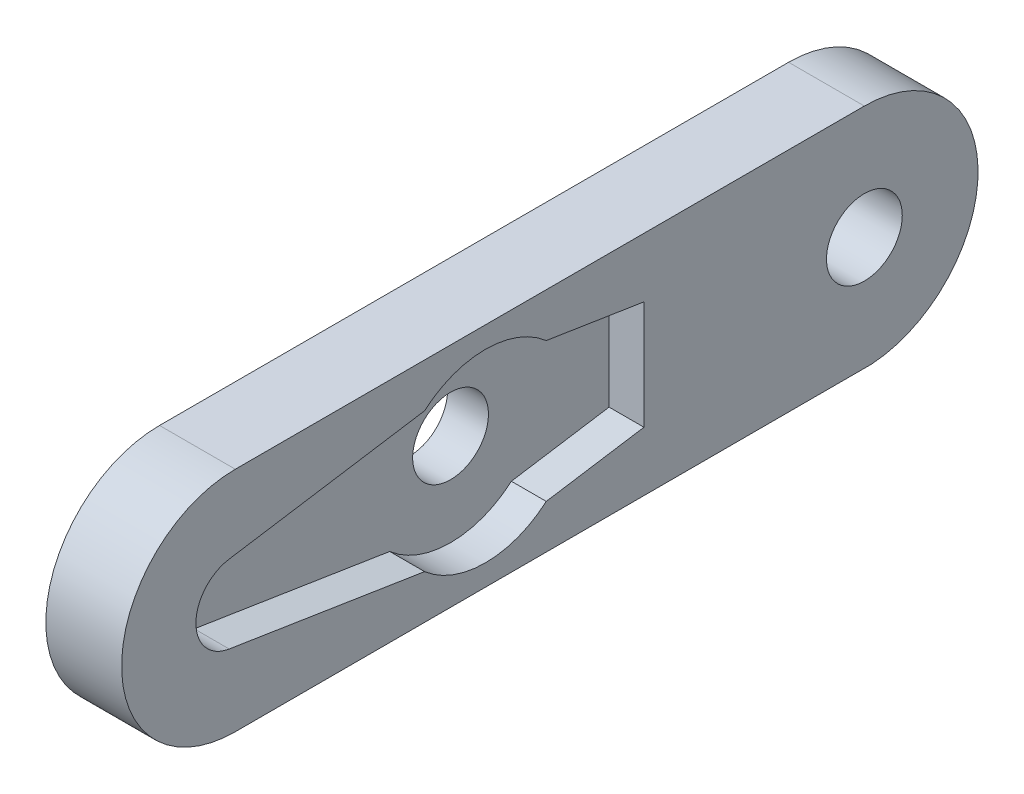
ISO-10303-21;
HEADER;
FILE_DESCRIPTION(('STEP AP214'),'2;1');
FILE_NAME('part.step','',(''),(''),'','','');
FILE_SCHEMA(('AUTOMOTIVE_DESIGN { 1 0 10303 214 1 1 1 1 }'));
ENDSEC;
DATA;
#1=APPLICATION_CONTEXT('core data for automotive mechanical design processes');
#2=APPLICATION_PROTOCOL_DEFINITION('international standard','automotive_design',2000,#1);
#3=PRODUCT_CONTEXT('',#1,'mechanical');
#4=PRODUCT('Part','Part','',(#3));
#5=PRODUCT_RELATED_PRODUCT_CATEGORY('part','',(#4));
#6=PRODUCT_DEFINITION_FORMATION('','',#4);
#7=PRODUCT_DEFINITION_CONTEXT('part definition',#1,'design');
#8=PRODUCT_DEFINITION('design','',#6,#7);
#9=PRODUCT_DEFINITION_SHAPE('','',#8);
#10=(LENGTH_UNIT() NAMED_UNIT(*) SI_UNIT(.MILLI.,.METRE.));
#11=(NAMED_UNIT(*) PLANE_ANGLE_UNIT() SI_UNIT($,.RADIAN.));
#12=(NAMED_UNIT(*) SI_UNIT($,.STERADIAN.) SOLID_ANGLE_UNIT());
#13=UNCERTAINTY_MEASURE_WITH_UNIT(LENGTH_MEASURE(1.E-05),#10,'distance_accuracy_value','');
#14=(GEOMETRIC_REPRESENTATION_CONTEXT(3) GLOBAL_UNCERTAINTY_ASSIGNED_CONTEXT((#13)) GLOBAL_UNIT_ASSIGNED_CONTEXT((#10,
#11,#12)) REPRESENTATION_CONTEXT('',''));
#15=CARTESIAN_POINT('',(0.,0.,0.));
#16=DIRECTION('',(0.,0.,1.));
#17=DIRECTION('',(1.,0.,0.));
#18=AXIS2_PLACEMENT_3D('',#15,#16,#17);
#19=CARTESIAN_POINT('',(2.3,0.,0.));
#20=DIRECTION('',(-1.,0.,0.));
#21=DIRECTION('',(0.,0.,1.));
#22=AXIS2_PLACEMENT_3D('',#19,#20,#21);
#23=CYLINDRICAL_SURFACE('',#22,6.1);
#24=CARTESIAN_POINT('',(0.,0.,0.));
#25=DIRECTION('',(1.,0.,0.));
#26=DIRECTION('',(0.,0.,-1.));
#27=AXIS2_PLACEMENT_3D('',#24,#25,#26);
#28=CIRCLE('',#27,6.1);
#29=CARTESIAN_POINT('',(0.,-4.59428599586623,4.0127965545474));
#30=VERTEX_POINT('',#29);
#31=CARTESIAN_POINT('',(0.,-4.59428599586623,-4.0127965545474));
#32=VERTEX_POINT('',#31);
#33=EDGE_CURVE('E177',#30,#32,#28,.T.);
#34=ORIENTED_EDGE('',*,*,#33,.F.);
#35=DIRECTION('',(-1.,0.,0.));
#36=VECTOR('',#35,1.);
#37=CARTESIAN_POINT('',(2.3,-4.59428599586623,4.0127965545474));
#38=LINE('',#37,#36);
#39=CARTESIAN_POINT('',(2.3,-4.59428599586623,4.0127965545474));
#40=VERTEX_POINT('',#39);
#41=EDGE_CURVE('E12',#40,#30,#38,.T.);
#42=ORIENTED_EDGE('',*,*,#41,.F.);
#43=CARTESIAN_POINT('',(2.3,0.,0.));
#44=DIRECTION('',(1.,0.,0.));
#45=DIRECTION('',(0.,0.,-1.));
#46=AXIS2_PLACEMENT_3D('',#43,#44,#45);
#47=CIRCLE('',#46,6.1);
#48=CARTESIAN_POINT('',(2.3,-4.59428599586623,-4.0127965545474));
#49=VERTEX_POINT('',#48);
#50=EDGE_CURVE('E271',#40,#49,#47,.T.);
#51=ORIENTED_EDGE('',*,*,#50,.T.);
#52=DIRECTION('',(-1.,0.,0.));
#53=VECTOR('',#52,1.);
#54=CARTESIAN_POINT('',(2.3,-4.59428599586623,-4.0127965545474));
#55=LINE('',#54,#53);
#56=EDGE_CURVE('E80',#49,#32,#55,.T.);
#57=ORIENTED_EDGE('',*,*,#56,.T.);
#58=EDGE_LOOP('',(#34,#42,#51,#57));
#59=FACE_BOUND('',#58,.T.);
#60=ADVANCED_FACE('F60',(#59),#23,.F.);
#61=CARTESIAN_POINT('',(2.3,-5.09897447345055,0.801308910131236));
#62=DIRECTION('',(0.,0.987875892570632,-0.155245679095352));
#63=DIRECTION('',(0.,0.155245679095352,0.987875892570632));
#64=AXIS2_PLACEMENT_3D('',#61,#62,#63);
#65=PLANE('',#64);
#66=DIRECTION('',(0.,-0.155245679095352,-0.987875892570632));
#67=VECTOR('',#66,1.);
#68=CARTESIAN_POINT('',(0.,-5.09897447345055,0.801308910131236));
#69=LINE('',#68,#67);
#70=CARTESIAN_POINT('',(0.,-2.56847732068365,16.9036387656479));
#71=VERTEX_POINT('',#70);
#72=EDGE_CURVE('E181',#71,#30,#69,.T.);
#73=ORIENTED_EDGE('',*,*,#72,.F.);
#74=DIRECTION('',(-1.,0.,0.));
#75=VECTOR('',#74,1.);
#76=CARTESIAN_POINT('',(2.3,-2.56847732068365,16.9036387656479));
#77=LINE('',#76,#75);
#78=CARTESIAN_POINT('',(2.3,-2.56847732068365,16.9036387656479));
#79=VERTEX_POINT('',#78);
#80=EDGE_CURVE('E71',#79,#71,#77,.T.);
#81=ORIENTED_EDGE('',*,*,#80,.F.);
#82=DIRECTION('',(0.,-0.155245679095352,-0.987875892570632));
#83=VECTOR('',#82,1.);
#84=CARTESIAN_POINT('',(2.3,-5.09897447345055,0.801308910131236));
#85=LINE('',#84,#83);
#86=EDGE_CURVE('E274',#79,#40,#85,.T.);
#87=ORIENTED_EDGE('',*,*,#86,.T.);
#88=ORIENTED_EDGE('',*,*,#41,.T.);
#89=EDGE_LOOP('',(#73,#81,#87,#88));
#90=FACE_BOUND('',#89,.T.);
#91=ADVANCED_FACE('F307',(#90),#65,.T.);
#92=CARTESIAN_POINT('',(2.3,0.,16.5));
#93=DIRECTION('',(-1.,0.,0.));
#94=DIRECTION('',(0.,0.,1.));
#95=AXIS2_PLACEMENT_3D('',#92,#93,#94);
#96=CYLINDRICAL_SURFACE('',#95,2.6);
#97=CARTESIAN_POINT('',(0.,0.,16.5));
#98=DIRECTION('',(1.,0.,0.));
#99=DIRECTION('',(0.,0.,-1.));
#100=AXIS2_PLACEMENT_3D('',#97,#98,#99);
#101=CIRCLE('',#100,2.6);
#102=CARTESIAN_POINT('',(0.,2.56847732068364,16.9036387656479));
#103=VERTEX_POINT('',#102);
#104=EDGE_CURVE('E186',#103,#71,#101,.T.);
#105=ORIENTED_EDGE('',*,*,#104,.F.);
#106=DIRECTION('',(-1.,0.,0.));
#107=VECTOR('',#106,1.);
#108=CARTESIAN_POINT('',(2.3,2.56847732068364,16.9036387656479));
#109=LINE('',#108,#107);
#110=CARTESIAN_POINT('',(2.3,2.56847732068364,16.9036387656479));
#111=VERTEX_POINT('',#110);
#112=EDGE_CURVE('E218',#111,#103,#109,.T.);
#113=ORIENTED_EDGE('',*,*,#112,.F.);
#114=CARTESIAN_POINT('',(2.3,0.,16.5));
#115=DIRECTION('',(1.,0.,0.));
#116=DIRECTION('',(0.,0.,-1.));
#117=AXIS2_PLACEMENT_3D('',#114,#115,#116);
#118=CIRCLE('',#117,2.6);
#119=EDGE_CURVE('E278',#111,#79,#118,.T.);
#120=ORIENTED_EDGE('',*,*,#119,.T.);
#121=ORIENTED_EDGE('',*,*,#80,.T.);
#122=EDGE_LOOP('',(#105,#113,#120,#121));
#123=FACE_BOUND('',#122,.T.);
#124=ADVANCED_FACE('F312',(#123),#96,.F.);
#125=CARTESIAN_POINT('',(2.3,5.09897447345054,0.801308910131234));
#126=DIRECTION('',(0.,-0.987875892570632,-0.155245679095352));
#127=DIRECTION('',(0.,0.155245679095352,-0.987875892570632));
#128=AXIS2_PLACEMENT_3D('',#125,#126,#127);
#129=PLANE('',#128);
#130=DIRECTION('',(0.,-0.155245679095352,0.987875892570632));
#131=VECTOR('',#130,1.);
#132=CARTESIAN_POINT('',(0.,5.09897447345054,0.801308910131234));
#133=LINE('',#132,#131);
#134=CARTESIAN_POINT('',(0.,4.59428599586623,4.0127965545474));
#135=VERTEX_POINT('',#134);
#136=EDGE_CURVE('E190',#135,#103,#133,.T.);
#137=ORIENTED_EDGE('',*,*,#136,.F.);
#138=DIRECTION('',(-1.,0.,0.));
#139=VECTOR('',#138,1.);
#140=CARTESIAN_POINT('',(2.3,4.59428599586623,4.0127965545474));
#141=LINE('',#140,#139);
#142=CARTESIAN_POINT('',(2.3,4.59428599586623,4.0127965545474));
#143=VERTEX_POINT('',#142);
#144=EDGE_CURVE('E215',#143,#135,#141,.T.);
#145=ORIENTED_EDGE('',*,*,#144,.F.);
#146=DIRECTION('',(0.,-0.155245679095352,0.987875892570632));
#147=VECTOR('',#146,1.);
#148=CARTESIAN_POINT('',(2.3,5.09897447345054,0.801308910131234));
#149=LINE('',#148,#147);
#150=EDGE_CURVE('E170',#143,#111,#149,.T.);
#151=ORIENTED_EDGE('',*,*,#150,.T.);
#152=ORIENTED_EDGE('',*,*,#112,.T.);
#153=EDGE_LOOP('',(#137,#145,#151,#152));
#154=FACE_BOUND('',#153,.T.);
#155=ADVANCED_FACE('F285',(#154),#129,.T.);
#156=CARTESIAN_POINT('',(2.3,0.,0.));
#157=DIRECTION('',(-1.,0.,0.));
#158=DIRECTION('',(0.,0.,1.));
#159=AXIS2_PLACEMENT_3D('',#156,#157,#158);
#160=CYLINDRICAL_SURFACE('',#159,6.10000000000002);
#161=CARTESIAN_POINT('',(0.,0.,0.));
#162=DIRECTION('',(1.,0.,0.));
#163=DIRECTION('',(0.,0.,-1.));
#164=AXIS2_PLACEMENT_3D('',#161,#162,#163);
#165=CIRCLE('',#164,6.10000000000002);
#166=CARTESIAN_POINT('',(0.,4.59428599586622,-4.0127965545474));
#167=VERTEX_POINT('',#166);
#168=EDGE_CURVE('E194',#167,#135,#165,.T.);
#169=ORIENTED_EDGE('',*,*,#168,.F.);
#170=DIRECTION('',(-1.,0.,0.));
#171=VECTOR('',#170,1.);
#172=CARTESIAN_POINT('',(2.3,4.59428599586622,-4.0127965545474));
#173=LINE('',#172,#171);
#174=CARTESIAN_POINT('',(2.3,4.59428599586622,-4.0127965545474));
#175=VERTEX_POINT('',#174);
#176=EDGE_CURVE('E152',#175,#167,#173,.T.);
#177=ORIENTED_EDGE('',*,*,#176,.F.);
#178=CARTESIAN_POINT('',(2.3,0.,0.));
#179=DIRECTION('',(1.,0.,0.));
#180=DIRECTION('',(0.,0.,-1.));
#181=AXIS2_PLACEMENT_3D('',#178,#179,#180);
#182=CIRCLE('',#181,6.10000000000002);
#183=EDGE_CURVE('E166',#175,#143,#182,.T.);
#184=ORIENTED_EDGE('',*,*,#183,.T.);
#185=ORIENTED_EDGE('',*,*,#144,.T.);
#186=EDGE_LOOP('',(#169,#177,#184,#185));
#187=FACE_BOUND('',#186,.T.);
#188=ADVANCED_FACE('F291',(#187),#160,.F.);
#189=CARTESIAN_POINT('',(2.3,5.09897447345054,-0.801308910131233));
#190=DIRECTION('',(0.,-0.987875892570632,0.155245679095352));
#191=DIRECTION('',(0.,-0.155245679095352,-0.987875892570632));
#192=AXIS2_PLACEMENT_3D('',#189,#190,#191);
#193=PLANE('',#192);
#194=DIRECTION('',(0.,0.155245679095352,0.987875892570632));
#195=VECTOR('',#194,1.);
#196=CARTESIAN_POINT('',(0.,5.09897447345054,-0.801308910131233));
#197=LINE('',#196,#195);
#198=CARTESIAN_POINT('',(0.,3.58138165827493,-10.4582176600977));
#199=VERTEX_POINT('',#198);
#200=EDGE_CURVE('E148',#199,#167,#197,.T.);
#201=ORIENTED_EDGE('',*,*,#200,.F.);
#202=DIRECTION('',(-1.,0.,0.));
#203=VECTOR('',#202,1.);
#204=CARTESIAN_POINT('',(2.3,3.58138165827493,-10.4582176600977));
#205=LINE('',#204,#203);
#206=CARTESIAN_POINT('',(2.3,3.58138165827493,-10.4582176600977));
#207=VERTEX_POINT('',#206);
#208=EDGE_CURVE('E142',#207,#199,#205,.T.);
#209=ORIENTED_EDGE('',*,*,#208,.F.);
#210=DIRECTION('',(0.,0.155245679095352,0.987875892570632));
#211=VECTOR('',#210,1.);
#212=CARTESIAN_POINT('',(2.3,5.09897447345054,-0.801308910131233));
#213=LINE('',#212,#211);
#214=EDGE_CURVE('E146',#207,#175,#213,.T.);
#215=ORIENTED_EDGE('',*,*,#214,.T.);
#216=ORIENTED_EDGE('',*,*,#176,.T.);
#217=EDGE_LOOP('',(#201,#209,#215,#216));
#218=FACE_BOUND('',#217,.T.);
#219=ADVANCED_FACE('F144',(#218),#193,.T.);
#220=CARTESIAN_POINT('',(2.3,0.,-10.4582176600977));
#221=DIRECTION('',(0.,0.,-1.));
#222=DIRECTION('',(0.,1.,0.));
#223=AXIS2_PLACEMENT_3D('',#220,#221,#222);
#224=PLANE('',#223);
#225=DIRECTION('',(0.,-1.,0.));
#226=VECTOR('',#225,1.);
#227=CARTESIAN_POINT('',(0.,0.,-10.4582176600977));
#228=LINE('',#227,#226);
#229=CARTESIAN_POINT('',(0.,-3.58138165827494,-10.4582176600977));
#230=VERTEX_POINT('',#229);
#231=EDGE_CURVE('E200',#199,#230,#228,.T.);
#232=ORIENTED_EDGE('',*,*,#231,.T.);
#233=DIRECTION('',(-1.,0.,0.));
#234=VECTOR('',#233,1.);
#235=CARTESIAN_POINT('',(2.3,-3.58138165827494,-10.4582176600977));
#236=LINE('',#235,#234);
#237=CARTESIAN_POINT('',(2.3,-3.58138165827494,-10.4582176600977));
#238=VERTEX_POINT('',#237);
#239=EDGE_CURVE('E105',#238,#230,#236,.T.);
#240=ORIENTED_EDGE('',*,*,#239,.F.);
#241=DIRECTION('',(0.,-1.,0.));
#242=VECTOR('',#241,1.);
#243=CARTESIAN_POINT('',(2.3,0.,-10.4582176600977));
#244=LINE('',#243,#242);
#245=EDGE_CURVE('E154',#207,#238,#244,.T.);
#246=ORIENTED_EDGE('',*,*,#245,.F.);
#247=ORIENTED_EDGE('',*,*,#208,.T.);
#248=EDGE_LOOP('',(#232,#240,#246,#247));
#249=FACE_BOUND('',#248,.T.);
#250=ADVANCED_FACE('F155',(#249),#224,.F.);
#251=CARTESIAN_POINT('',(2.3,0.,16.5));
#252=DIRECTION('',(-1.,0.,0.));
#253=DIRECTION('',(0.,0.,1.));
#254=AXIS2_PLACEMENT_3D('',#251,#252,#253);
#255=CYLINDRICAL_SURFACE('',#254,7.5);
#256=DIRECTION('',(-1.,0.,0.));
#257=VECTOR('',#256,1.);
#258=CARTESIAN_POINT('',(2.3,7.5,16.5));
#259=LINE('',#258,#257);
#260=CARTESIAN_POINT('',(2.3,7.5,16.5));
#261=VERTEX_POINT('',#260);
#262=CARTESIAN_POINT('',(-2.7,7.5,16.5));
#263=VERTEX_POINT('',#262);
#264=EDGE_CURVE('E176',#261,#263,#259,.T.);
#265=ORIENTED_EDGE('',*,*,#264,.T.);
#266=CARTESIAN_POINT('',(-2.7,0.,16.5));
#267=DIRECTION('',(-1.,0.,0.));
#268=DIRECTION('',(0.,0.,1.));
#269=AXIS2_PLACEMENT_3D('',#266,#267,#268);
#270=CIRCLE('',#269,7.5);
#271=CARTESIAN_POINT('',(-2.7,-7.5,16.5));
#272=VERTEX_POINT('',#271);
#273=EDGE_CURVE('E245',#272,#263,#270,.T.);
#274=ORIENTED_EDGE('',*,*,#273,.F.);
#275=DIRECTION('',(-1.,0.,0.));
#276=VECTOR('',#275,1.);
#277=CARTESIAN_POINT('',(2.3,-7.50000000000001,16.5));
#278=LINE('',#277,#276);
#279=CARTESIAN_POINT('',(2.3,-7.50000000000001,16.5));
#280=VERTEX_POINT('',#279);
#281=EDGE_CURVE('E210',#280,#272,#278,.T.);
#282=ORIENTED_EDGE('',*,*,#281,.F.);
#283=CARTESIAN_POINT('',(2.3,0.,16.5));
#284=DIRECTION('',(1.,0.,0.));
#285=DIRECTION('',(0.,0.,-1.));
#286=AXIS2_PLACEMENT_3D('',#283,#284,#285);
#287=CIRCLE('',#286,7.5);
#288=EDGE_CURVE('E207',#261,#280,#287,.T.);
#289=ORIENTED_EDGE('',*,*,#288,.F.);
#290=EDGE_LOOP('',(#265,#274,#282,#289));
#291=FACE_BOUND('',#290,.T.);
#292=ADVANCED_FACE('F62',(#291),#255,.T.);
#293=CARTESIAN_POINT('',(2.3,-7.49309549458025,-0.00313492670834083));
#294=DIRECTION('',(0.,0.99999991248103,0.000418375347844261));
#295=DIRECTION('',(0.,-0.000418375347844261,0.99999991248103));
#296=AXIS2_PLACEMENT_3D('',#293,#294,#295);
#297=PLANE('',#296);
#298=ORIENTED_EDGE('',*,*,#281,.T.);
#299=DIRECTION('',(0.,-0.00041837534784426,0.99999991248103));
#300=VECTOR('',#299,1.);
#301=CARTESIAN_POINT('',(-2.7,-7.48452785045643,-20.4815006290153));
#302=LINE('',#301,#300);
#303=CARTESIAN_POINT('',(-2.7,-7.48452785045643,-20.4815006290153));
#304=VERTEX_POINT('',#303);
#305=EDGE_CURVE('E182',#304,#272,#302,.T.);
#306=ORIENTED_EDGE('',*,*,#305,.F.);
#307=DIRECTION('',(-1.,0.,0.));
#308=VECTOR('',#307,1.);
#309=CARTESIAN_POINT('',(2.3,-7.48452785045643,-20.4815006290153));
#310=LINE('',#309,#308);
#311=CARTESIAN_POINT('',(2.3,-7.48452785045643,-20.4815006290153));
#312=VERTEX_POINT('',#311);
#313=EDGE_CURVE('E226',#312,#304,#310,.T.);
#314=ORIENTED_EDGE('',*,*,#313,.F.);
#315=DIRECTION('',(0.,0.000418375347844261,-0.99999991248103));
#316=VECTOR('',#315,1.);
#317=CARTESIAN_POINT('',(2.3,-7.49309549458025,-0.00313492670834083));
#318=LINE('',#317,#316);
#319=EDGE_CURVE('E117',#280,#312,#318,.T.);
#320=ORIENTED_EDGE('',*,*,#319,.F.);
#321=EDGE_LOOP('',(#298,#306,#314,#320));
#322=FACE_BOUND('',#321,.T.);
#323=ADVANCED_FACE('F234',(#322),#297,.F.);
#324=CARTESIAN_POINT('',(2.3,-5.09897447345055,-0.801308910131234));
#325=DIRECTION('',(0.,0.987875892570632,0.155245679095352));
#326=DIRECTION('',(0.,-0.155245679095352,0.987875892570632));
#327=AXIS2_PLACEMENT_3D('',#324,#325,#326);
#328=PLANE('',#327);
#329=DIRECTION('',(0.,0.155245679095352,-0.987875892570632));
#330=VECTOR('',#329,1.);
#331=CARTESIAN_POINT('',(0.,-5.09897447345055,-0.801308910131234));
#332=LINE('',#331,#330);
#333=EDGE_CURVE('E203',#32,#230,#332,.T.);
#334=ORIENTED_EDGE('',*,*,#333,.F.);
#335=ORIENTED_EDGE('',*,*,#56,.F.);
#336=DIRECTION('',(0.,0.155245679095352,-0.987875892570632));
#337=VECTOR('',#336,1.);
#338=CARTESIAN_POINT('',(2.3,-5.09897447345055,-0.801308910131234));
#339=LINE('',#338,#337);
#340=EDGE_CURVE('E159',#49,#238,#339,.T.);
#341=ORIENTED_EDGE('',*,*,#340,.T.);
#342=ORIENTED_EDGE('',*,*,#239,.T.);
#343=EDGE_LOOP('',(#334,#335,#341,#342));
#344=FACE_BOUND('',#343,.T.);
#345=ADVANCED_FACE('F294',(#344),#328,.T.);
#346=CARTESIAN_POINT('',(2.3,7.5,0.));
#347=DIRECTION('',(0.,1.,0.));
#348=DIRECTION('',(0.,0.,1.));
#349=AXIS2_PLACEMENT_3D('',#346,#347,#348);
#350=PLANE('',#349);
#351=DIRECTION('',(0.,0.,-1.));
#352=VECTOR('',#351,1.);
#353=CARTESIAN_POINT('',(2.3,7.5,0.));
#354=LINE('',#353,#352);
#355=CARTESIAN_POINT('',(2.3,7.5,-25.));
#356=VERTEX_POINT('',#355);
#357=EDGE_CURVE('E267',#261,#356,#354,.T.);
#358=ORIENTED_EDGE('',*,*,#357,.T.);
#359=DIRECTION('',(1.,0.,0.));
#360=VECTOR('',#359,1.);
#361=CARTESIAN_POINT('',(-2.7,7.5,-25.));
#362=LINE('',#361,#360);
#363=CARTESIAN_POINT('',(-2.7,7.5,-25.));
#364=VERTEX_POINT('',#363);
#365=EDGE_CURVE('E521',#364,#356,#362,.T.);
#366=ORIENTED_EDGE('',*,*,#365,.F.);
#367=DIRECTION('',(0.,0.,-1.));
#368=VECTOR('',#367,1.);
#369=CARTESIAN_POINT('',(-2.7,7.5,16.5));
#370=LINE('',#369,#368);
#371=EDGE_CURVE('E250',#263,#364,#370,.T.);
#372=ORIENTED_EDGE('',*,*,#371,.F.);
#373=ORIENTED_EDGE('',*,*,#264,.F.);
#374=EDGE_LOOP('',(#358,#366,#372,#373));
#375=FACE_BOUND('',#374,.T.);
#376=ADVANCED_FACE('F296',(#375),#350,.T.);
#377=CARTESIAN_POINT('',(2.3,0.,0.));
#378=DIRECTION('',(1.,0.,0.));
#379=DIRECTION('',(0.,0.,-1.));
#380=AXIS2_PLACEMENT_3D('',#377,#378,#379);
#381=PLANE('',#380);
#382=CARTESIAN_POINT('',(2.3,0.,-25.));
#383=DIRECTION('',(1.,0.,0.));
#384=DIRECTION('',(0.,0.,-1.));
#385=AXIS2_PLACEMENT_3D('',#382,#383,#384);
#386=CIRCLE('',#385,2.5);
#387=CARTESIAN_POINT('',(2.3,0.,-27.5));
#388=VERTEX_POINT('',#387);
#389=EDGE_CURVE('E547',#388,#388,#386,.T.);
#390=ORIENTED_EDGE('',*,*,#389,.F.);
#391=EDGE_LOOP('',(#390));
#392=FACE_BOUND('',#391,.T.);
#393=ORIENTED_EDGE('',*,*,#288,.T.);
#394=ORIENTED_EDGE('',*,*,#319,.T.);
#395=DIRECTION('',(0.,0.,1.));
#396=VECTOR('',#395,1.);
#397=CARTESIAN_POINT('',(2.3,-7.48452785045645,0.));
#398=LINE('',#397,#396);
#399=CARTESIAN_POINT('',(2.3,-7.48452785045643,-25.4815006290153));
#400=VERTEX_POINT('',#399);
#401=EDGE_CURVE('E538',#400,#312,#398,.T.);
#402=ORIENTED_EDGE('',*,*,#401,.F.);
#403=CARTESIAN_POINT('',(2.3,0.,-25.));
#404=DIRECTION('',(1.,0.,0.));
#405=DIRECTION('',(0.,0.,-1.));
#406=AXIS2_PLACEMENT_3D('',#403,#404,#405);
#407=CIRCLE('',#406,7.5);
#408=EDGE_CURVE('E535',#400,#356,#407,.T.);
#409=ORIENTED_EDGE('',*,*,#408,.T.);
#410=ORIENTED_EDGE('',*,*,#357,.F.);
#411=EDGE_LOOP('',(#393,#394,#402,#409,#410));
#412=FACE_BOUND('',#411,.T.);
#413=ORIENTED_EDGE('',*,*,#50,.F.);
#414=ORIENTED_EDGE('',*,*,#86,.F.);
#415=ORIENTED_EDGE('',*,*,#119,.F.);
#416=ORIENTED_EDGE('',*,*,#150,.F.);
#417=ORIENTED_EDGE('',*,*,#183,.F.);
#418=ORIENTED_EDGE('',*,*,#214,.F.);
#419=ORIENTED_EDGE('',*,*,#245,.T.);
#420=ORIENTED_EDGE('',*,*,#340,.F.);
#421=EDGE_LOOP('',(#413,#414,#415,#416,#417,#418,#419,#420));
#422=FACE_BOUND('',#421,.T.);
#423=ADVANCED_FACE('F163',(#392,#412,#422),#381,.T.);
#424=CARTESIAN_POINT('',(0.,0.,16.5));
#425=DIRECTION('',(-1.,0.,0.));
#426=DIRECTION('',(0.,0.,1.));
#427=AXIS2_PLACEMENT_3D('',#424,#425,#426);
#428=PLANE('',#427);
#429=CARTESIAN_POINT('',(0.,0.,0.));
#430=DIRECTION('',(1.,0.,0.));
#431=DIRECTION('',(0.,0.,-1.));
#432=AXIS2_PLACEMENT_3D('',#429,#430,#431);
#433=CIRCLE('',#432,2.5);
#434=CARTESIAN_POINT('',(0.,0.,-2.5));
#435=VERTEX_POINT('',#434);
#436=EDGE_CURVE('E259',#435,#435,#433,.T.);
#437=ORIENTED_EDGE('',*,*,#436,.F.);
#438=EDGE_LOOP('',(#437));
#439=FACE_BOUND('',#438,.T.);
#440=ORIENTED_EDGE('',*,*,#72,.T.);
#441=ORIENTED_EDGE('',*,*,#33,.T.);
#442=ORIENTED_EDGE('',*,*,#333,.T.);
#443=ORIENTED_EDGE('',*,*,#231,.F.);
#444=ORIENTED_EDGE('',*,*,#200,.T.);
#445=ORIENTED_EDGE('',*,*,#168,.T.);
#446=ORIENTED_EDGE('',*,*,#136,.T.);
#447=ORIENTED_EDGE('',*,*,#104,.T.);
#448=EDGE_LOOP('',(#440,#441,#442,#443,#444,#445,#446,#447));
#449=FACE_BOUND('',#448,.T.);
#450=ADVANCED_FACE('F293',(#439,#449),#428,.F.);
#451=CARTESIAN_POINT('',(-2.7,0.,16.5));
#452=DIRECTION('',(-1.,0.,0.));
#453=DIRECTION('',(0.,0.,1.));
#454=AXIS2_PLACEMENT_3D('',#451,#452,#453);
#455=PLANE('',#454);
#456=CARTESIAN_POINT('',(-2.7,0.,-25.));
#457=DIRECTION('',(1.,0.,0.));
#458=DIRECTION('',(0.,0.,-1.));
#459=AXIS2_PLACEMENT_3D('',#456,#457,#458);
#460=CIRCLE('',#459,2.5);
#461=CARTESIAN_POINT('',(-2.7,0.,-27.5));
#462=VERTEX_POINT('',#461);
#463=EDGE_CURVE('E542',#462,#462,#460,.T.);
#464=ORIENTED_EDGE('',*,*,#463,.T.);
#465=EDGE_LOOP('',(#464));
#466=FACE_BOUND('',#465,.T.);
#467=CARTESIAN_POINT('',(-2.7,0.,0.));
#468=DIRECTION('',(-1.,0.,0.));
#469=DIRECTION('',(0.,0.,1.));
#470=AXIS2_PLACEMENT_3D('',#467,#468,#469);
#471=CIRCLE('',#470,2.5);
#472=CARTESIAN_POINT('',(-2.7,0.,2.5));
#473=VERTEX_POINT('',#472);
#474=EDGE_CURVE('E64',#473,#473,#471,.T.);
#475=ORIENTED_EDGE('',*,*,#474,.F.);
#476=EDGE_LOOP('',(#475));
#477=FACE_BOUND('',#476,.T.);
#478=ORIENTED_EDGE('',*,*,#273,.T.);
#479=ORIENTED_EDGE('',*,*,#371,.T.);
#480=CARTESIAN_POINT('',(-2.7,0.,-25.));
#481=DIRECTION('',(1.,0.,0.));
#482=DIRECTION('',(0.,0.,-1.));
#483=AXIS2_PLACEMENT_3D('',#480,#481,#482);
#484=CIRCLE('',#483,7.5);
#485=CARTESIAN_POINT('',(-2.7,-7.48452785045643,-25.4815006290153));
#486=VERTEX_POINT('',#485);
#487=EDGE_CURVE('E533',#486,#364,#484,.T.);
#488=ORIENTED_EDGE('',*,*,#487,.F.);
#489=DIRECTION('',(0.,0.,1.));
#490=VECTOR('',#489,1.);
#491=CARTESIAN_POINT('',(-2.7,-7.48452785045645,0.));
#492=LINE('',#491,#490);
#493=EDGE_CURVE('E248',#486,#304,#492,.T.);
#494=ORIENTED_EDGE('',*,*,#493,.T.);
#495=ORIENTED_EDGE('',*,*,#305,.T.);
#496=EDGE_LOOP('',(#478,#479,#488,#494,#495));
#497=FACE_BOUND('',#496,.T.);
#498=ADVANCED_FACE('F242',(#466,#477,#497),#455,.T.);
#499=CARTESIAN_POINT('',(-10.,0.,0.));
#500=DIRECTION('',(1.,0.,0.));
#501=DIRECTION('',(0.,0.,-1.));
#502=AXIS2_PLACEMENT_3D('',#499,#500,#501);
#503=CYLINDRICAL_SURFACE('',#502,2.5);
#504=ORIENTED_EDGE('',*,*,#474,.T.);
#505=EDGE_LOOP('',(#504));
#506=FACE_BOUND('',#505,.T.);
#507=ORIENTED_EDGE('',*,*,#436,.T.);
#508=EDGE_LOOP('',(#507));
#509=FACE_BOUND('',#508,.T.);
#510=ADVANCED_FACE('F342',(#506,#509),#503,.F.);
#511=CARTESIAN_POINT('',(-2.7,-7.48452785045645,0.));
#512=DIRECTION('',(0.,1.,0.));
#513=DIRECTION('',(0.,0.,1.));
#514=AXIS2_PLACEMENT_3D('',#511,#512,#513);
#515=PLANE('',#514);
#516=ORIENTED_EDGE('',*,*,#401,.T.);
#517=ORIENTED_EDGE('',*,*,#313,.T.);
#518=ORIENTED_EDGE('',*,*,#493,.F.);
#519=DIRECTION('',(1.,0.,0.));
#520=VECTOR('',#519,1.);
#521=CARTESIAN_POINT('',(-2.7,-7.48452785045643,-25.4815006290153));
#522=LINE('',#521,#520);
#523=EDGE_CURVE('E524',#486,#400,#522,.T.);
#524=ORIENTED_EDGE('',*,*,#523,.T.);
#525=EDGE_LOOP('',(#516,#517,#518,#524));
#526=FACE_BOUND('',#525,.T.);
#527=ADVANCED_FACE('F355',(#526),#515,.F.);
#528=CARTESIAN_POINT('',(-2.7,0.,-25.));
#529=DIRECTION('',(1.,0.,0.));
#530=DIRECTION('',(0.,0.,-1.));
#531=AXIS2_PLACEMENT_3D('',#528,#529,#530);
#532=CYLINDRICAL_SURFACE('',#531,7.5);
#533=ORIENTED_EDGE('',*,*,#408,.F.);
#534=ORIENTED_EDGE('',*,*,#523,.F.);
#535=ORIENTED_EDGE('',*,*,#487,.T.);
#536=ORIENTED_EDGE('',*,*,#365,.T.);
#537=EDGE_LOOP('',(#533,#534,#535,#536));
#538=FACE_BOUND('',#537,.T.);
#539=ADVANCED_FACE('F360',(#538),#532,.T.);
#540=CARTESIAN_POINT('',(-2.7,0.,-25.));
#541=DIRECTION('',(1.,0.,0.));
#542=DIRECTION('',(0.,0.,-1.));
#543=AXIS2_PLACEMENT_3D('',#540,#541,#542);
#544=CYLINDRICAL_SURFACE('',#543,2.5);
#545=ORIENTED_EDGE('',*,*,#463,.F.);
#546=EDGE_LOOP('',(#545));
#547=FACE_BOUND('',#546,.T.);
#548=ORIENTED_EDGE('',*,*,#389,.T.);
#549=EDGE_LOOP('',(#548));
#550=FACE_BOUND('',#549,.T.);
#551=ADVANCED_FACE('F372',(#547,#550),#544,.F.);
#552=CLOSED_SHELL('',(#60,#91,#124,#155,#188,#219,#250,#292,#323,#345,#376,#423,#450,#498,#510,
#527,#539,#551));
#553=MANIFOLD_SOLID_BREP('B2',#552);
#554=ADVANCED_BREP_SHAPE_REPRESENTATION('',(#18,#553),#14);
#555=SHAPE_DEFINITION_REPRESENTATION(#9,#554);
ENDSEC;
END-ISO-10303-21;
